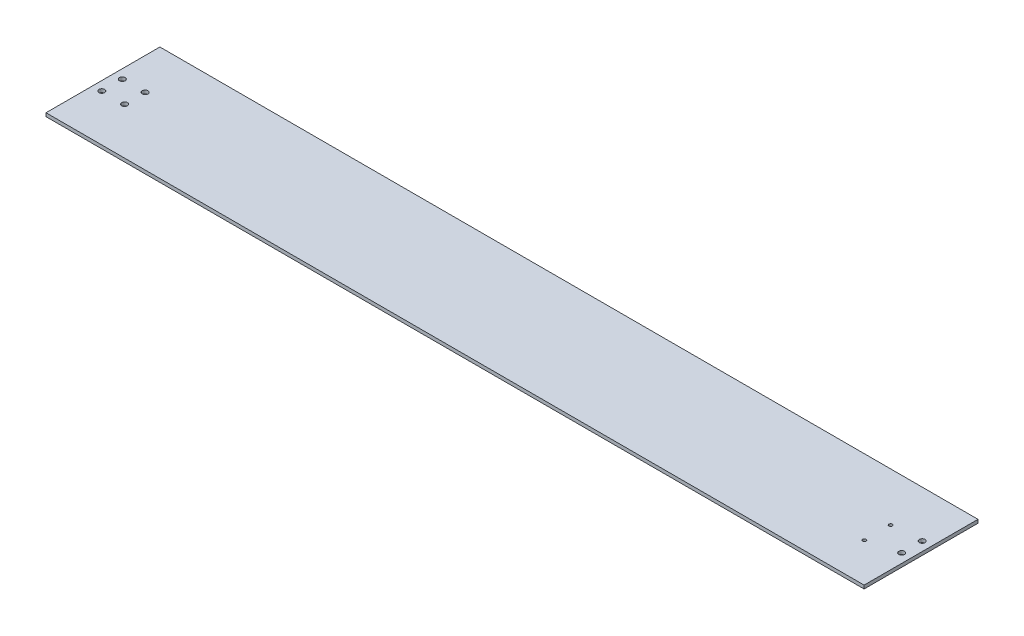
ISO-10303-21;
HEADER;
FILE_DESCRIPTION(('STEP AP214'),'2;1');
FILE_NAME('part.step','',(''),(''),'','','');
FILE_SCHEMA(('AUTOMOTIVE_DESIGN { 1 0 10303 214 1 1 1 1 }'));
ENDSEC;
DATA;
#1=APPLICATION_CONTEXT('core data for automotive mechanical design processes');
#2=APPLICATION_PROTOCOL_DEFINITION('international standard','automotive_design',2000,#1);
#3=PRODUCT_CONTEXT('',#1,'mechanical');
#4=PRODUCT('Part','Part','',(#3));
#5=PRODUCT_RELATED_PRODUCT_CATEGORY('part','',(#4));
#6=PRODUCT_DEFINITION_FORMATION('','',#4);
#7=PRODUCT_DEFINITION_CONTEXT('part definition',#1,'design');
#8=PRODUCT_DEFINITION('design','',#6,#7);
#9=PRODUCT_DEFINITION_SHAPE('','',#8);
#10=(LENGTH_UNIT() NAMED_UNIT(*) SI_UNIT(.MILLI.,.METRE.));
#11=(NAMED_UNIT(*) PLANE_ANGLE_UNIT() SI_UNIT($,.RADIAN.));
#12=(NAMED_UNIT(*) SI_UNIT($,.STERADIAN.) SOLID_ANGLE_UNIT());
#13=UNCERTAINTY_MEASURE_WITH_UNIT(LENGTH_MEASURE(1.E-05),#10,'distance_accuracy_value','');
#14=(GEOMETRIC_REPRESENTATION_CONTEXT(3) GLOBAL_UNCERTAINTY_ASSIGNED_CONTEXT((#13)) GLOBAL_UNIT_ASSIGNED_CONTEXT((#10,
#11,#12)) REPRESENTATION_CONTEXT('',''));
#15=CARTESIAN_POINT('',(0.,0.,0.));
#16=DIRECTION('',(0.,0.,1.));
#17=DIRECTION('',(1.,0.,0.));
#18=AXIS2_PLACEMENT_3D('',#15,#16,#17);
#19=CARTESIAN_POINT('',(0.,3.,0.));
#20=DIRECTION('',(-1.,0.,0.));
#21=DIRECTION('',(0.,0.,1.));
#22=AXIS2_PLACEMENT_3D('',#19,#20,#21);
#23=PLANE('',#22);
#24=DIRECTION('',(0.,0.,-1.));
#25=VECTOR('',#24,1.);
#26=CARTESIAN_POINT('',(0.,0.,0.));
#27=LINE('',#26,#25);
#28=CARTESIAN_POINT('',(0.,0.,0.));
#29=VERTEX_POINT('',#28);
#30=CARTESIAN_POINT('',(0.,0.,-100.));
#31=VERTEX_POINT('',#30);
#32=EDGE_CURVE('E102',#29,#31,#27,.T.);
#33=ORIENTED_EDGE('',*,*,#32,.T.);
#34=DIRECTION('',(0.,-1.,0.));
#35=VECTOR('',#34,1.);
#36=CARTESIAN_POINT('',(0.,3.,-100.));
#37=LINE('',#36,#35);
#38=CARTESIAN_POINT('',(0.,3.,-100.));
#39=VERTEX_POINT('',#38);
#40=EDGE_CURVE('E11',#39,#31,#37,.T.);
#41=ORIENTED_EDGE('',*,*,#40,.F.);
#42=DIRECTION('',(0.,0.,-1.));
#43=VECTOR('',#42,1.);
#44=CARTESIAN_POINT('',(0.,3.,0.));
#45=LINE('',#44,#43);
#46=CARTESIAN_POINT('',(0.,3.,0.));
#47=VERTEX_POINT('',#46);
#48=EDGE_CURVE('E89',#47,#39,#45,.T.);
#49=ORIENTED_EDGE('',*,*,#48,.F.);
#50=DIRECTION('',(0.,-1.,0.));
#51=VECTOR('',#50,1.);
#52=CARTESIAN_POINT('',(0.,3.,0.));
#53=LINE('',#52,#51);
#54=EDGE_CURVE('E98',#47,#29,#53,.T.);
#55=ORIENTED_EDGE('',*,*,#54,.T.);
#56=EDGE_LOOP('',(#33,#41,#49,#55));
#57=FACE_BOUND('',#56,.T.);
#58=ADVANCED_FACE('F36',(#57),#23,.F.);
#59=CARTESIAN_POINT('',(0.,3.,-100.));
#60=DIRECTION('',(0.,0.,1.));
#61=DIRECTION('',(1.,0.,0.));
#62=AXIS2_PLACEMENT_3D('',#59,#60,#61);
#63=PLANE('',#62);
#64=DIRECTION('',(-1.,0.,0.));
#65=VECTOR('',#64,1.);
#66=CARTESIAN_POINT('',(0.,0.,-100.));
#67=LINE('',#66,#65);
#68=CARTESIAN_POINT('',(-718.32,0.,-99.9999999999999));
#69=VERTEX_POINT('',#68);
#70=EDGE_CURVE('E93',#31,#69,#67,.T.);
#71=ORIENTED_EDGE('',*,*,#70,.T.);
#72=DIRECTION('',(0.,-1.,0.));
#73=VECTOR('',#72,1.);
#74=CARTESIAN_POINT('',(-718.32,3.,-99.9999999999999));
#75=LINE('',#74,#73);
#76=CARTESIAN_POINT('',(-718.32,3.,-99.9999999999999));
#77=VERTEX_POINT('',#76);
#78=EDGE_CURVE('E45',#77,#69,#75,.T.);
#79=ORIENTED_EDGE('',*,*,#78,.F.);
#80=DIRECTION('',(-1.,0.,0.));
#81=VECTOR('',#80,1.);
#82=CARTESIAN_POINT('',(0.,3.,-100.));
#83=LINE('',#82,#81);
#84=EDGE_CURVE('E84',#39,#77,#83,.T.);
#85=ORIENTED_EDGE('',*,*,#84,.F.);
#86=ORIENTED_EDGE('',*,*,#40,.T.);
#87=EDGE_LOOP('',(#71,#79,#85,#86));
#88=FACE_BOUND('',#87,.T.);
#89=ADVANCED_FACE('F92',(#88),#63,.F.);
#90=CARTESIAN_POINT('',(-718.32,3.,0.));
#91=DIRECTION('',(1.,0.,0.));
#92=DIRECTION('',(0.,0.,-1.));
#93=AXIS2_PLACEMENT_3D('',#90,#91,#92);
#94=PLANE('',#93);
#95=DIRECTION('',(0.,0.,1.));
#96=VECTOR('',#95,1.);
#97=CARTESIAN_POINT('',(-718.32,0.,0.));
#98=LINE('',#97,#96);
#99=CARTESIAN_POINT('',(-718.32,0.,0.));
#100=VERTEX_POINT('',#99);
#101=EDGE_CURVE('E71',#69,#100,#98,.T.);
#102=ORIENTED_EDGE('',*,*,#101,.T.);
#103=DIRECTION('',(0.,-1.,0.));
#104=VECTOR('',#103,1.);
#105=CARTESIAN_POINT('',(-718.32,3.,0.));
#106=LINE('',#105,#104);
#107=CARTESIAN_POINT('',(-718.32,3.,0.));
#108=VERTEX_POINT('',#107);
#109=EDGE_CURVE('E94',#108,#100,#106,.T.);
#110=ORIENTED_EDGE('',*,*,#109,.F.);
#111=DIRECTION('',(0.,0.,1.));
#112=VECTOR('',#111,1.);
#113=CARTESIAN_POINT('',(-718.32,3.,0.));
#114=LINE('',#113,#112);
#115=EDGE_CURVE('E87',#77,#108,#114,.T.);
#116=ORIENTED_EDGE('',*,*,#115,.F.);
#117=ORIENTED_EDGE('',*,*,#78,.T.);
#118=EDGE_LOOP('',(#102,#110,#116,#117));
#119=FACE_BOUND('',#118,.T.);
#120=ADVANCED_FACE('F96',(#119),#94,.F.);
#121=CARTESIAN_POINT('',(0.,3.,0.));
#122=DIRECTION('',(0.,0.,-1.));
#123=DIRECTION('',(-1.,0.,0.));
#124=AXIS2_PLACEMENT_3D('',#121,#122,#123);
#125=PLANE('',#124);
#126=DIRECTION('',(1.,0.,0.));
#127=VECTOR('',#126,1.);
#128=CARTESIAN_POINT('',(0.,0.,0.));
#129=LINE('',#128,#127);
#130=EDGE_CURVE('E77',#100,#29,#129,.T.);
#131=ORIENTED_EDGE('',*,*,#130,.T.);
#132=ORIENTED_EDGE('',*,*,#54,.F.);
#133=DIRECTION('',(1.,0.,0.));
#134=VECTOR('',#133,1.);
#135=CARTESIAN_POINT('',(0.,3.,0.));
#136=LINE('',#135,#134);
#137=EDGE_CURVE('E54',#108,#47,#136,.T.);
#138=ORIENTED_EDGE('',*,*,#137,.F.);
#139=ORIENTED_EDGE('',*,*,#109,.T.);
#140=EDGE_LOOP('',(#131,#132,#138,#139));
#141=FACE_BOUND('',#140,.T.);
#142=ADVANCED_FACE('F165',(#141),#125,.F.);
#143=CARTESIAN_POINT('',(0.,3.,0.));
#144=DIRECTION('',(0.,1.,0.));
#145=DIRECTION('',(0.,0.,1.));
#146=AXIS2_PLACEMENT_3D('',#143,#144,#145);
#147=PLANE('',#146);
#148=CARTESIAN_POINT('',(-34.,3.,-57.2768091799999));
#149=DIRECTION('',(0.,1.,0.));
#150=DIRECTION('',(0.,0.,1.));
#151=AXIS2_PLACEMENT_3D('',#148,#149,#150);
#152=CIRCLE('',#151,1.5);
#153=CARTESIAN_POINT('',(-34.,3.,-55.7768091799999));
#154=VERTEX_POINT('',#153);
#155=EDGE_CURVE('E132',#154,#154,#152,.T.);
#156=ORIENTED_EDGE('',*,*,#155,.F.);
#157=EDGE_LOOP('',(#156));
#158=FACE_BOUND('',#157,.T.);
#159=CARTESIAN_POINT('',(-34.,3.,-34.2768091799999));
#160=DIRECTION('',(0.,1.,0.));
#161=DIRECTION('',(0.,0.,1.));
#162=AXIS2_PLACEMENT_3D('',#159,#160,#161);
#163=CIRCLE('',#162,1.5);
#164=CARTESIAN_POINT('',(-34.,3.,-32.7768091799999));
#165=VERTEX_POINT('',#164);
#166=EDGE_CURVE('E138',#165,#165,#163,.T.);
#167=ORIENTED_EDGE('',*,*,#166,.F.);
#168=EDGE_LOOP('',(#167));
#169=FACE_BOUND('',#168,.T.);
#170=CARTESIAN_POINT('',(-690.32,3.,-58.9999999999999));
#171=DIRECTION('',(0.,1.,0.));
#172=DIRECTION('',(0.,0.,1.));
#173=AXIS2_PLACEMENT_3D('',#170,#171,#172);
#174=CIRCLE('',#173,2.49999999999991);
#175=CARTESIAN_POINT('',(-690.32,3.,-56.5));
#176=VERTEX_POINT('',#175);
#177=EDGE_CURVE('E127',#176,#176,#174,.T.);
#178=ORIENTED_EDGE('',*,*,#177,.F.);
#179=EDGE_LOOP('',(#178));
#180=FACE_BOUND('',#179,.T.);
#181=CARTESIAN_POINT('',(-690.32,3.,-40.9999999999999));
#182=DIRECTION('',(0.,1.,0.));
#183=DIRECTION('',(0.,0.,1.));
#184=AXIS2_PLACEMENT_3D('',#181,#182,#183);
#185=CIRCLE('',#184,2.49999999999991);
#186=CARTESIAN_POINT('',(-690.32,3.,-38.5));
#187=VERTEX_POINT('',#186);
#188=EDGE_CURVE('E136',#187,#187,#185,.T.);
#189=ORIENTED_EDGE('',*,*,#188,.F.);
#190=EDGE_LOOP('',(#189));
#191=FACE_BOUND('',#190,.T.);
#192=CARTESIAN_POINT('',(-8.00000000000001,3.,-59.0000000000001));
#193=DIRECTION('',(0.,1.,0.));
#194=DIRECTION('',(0.,0.,1.));
#195=AXIS2_PLACEMENT_3D('',#192,#193,#194);
#196=CIRCLE('',#195,2.5);
#197=CARTESIAN_POINT('',(-8.00000000000001,3.,-56.5000000000001));
#198=VERTEX_POINT('',#197);
#199=EDGE_CURVE('E152',#198,#198,#196,.T.);
#200=ORIENTED_EDGE('',*,*,#199,.F.);
#201=EDGE_LOOP('',(#200));
#202=FACE_BOUND('',#201,.T.);
#203=CARTESIAN_POINT('',(-710.32,3.,-41.));
#204=DIRECTION('',(0.,1.,0.));
#205=DIRECTION('',(0.,0.,1.));
#206=AXIS2_PLACEMENT_3D('',#203,#204,#205);
#207=CIRCLE('',#206,2.49999999999991);
#208=CARTESIAN_POINT('',(-710.32,3.,-38.5000000000001));
#209=VERTEX_POINT('',#208);
#210=EDGE_CURVE('E151',#209,#209,#207,.T.);
#211=ORIENTED_EDGE('',*,*,#210,.F.);
#212=EDGE_LOOP('',(#211));
#213=FACE_BOUND('',#212,.T.);
#214=CARTESIAN_POINT('',(-8.00000000000001,3.,-41.0000000000001));
#215=DIRECTION('',(0.,1.,0.));
#216=DIRECTION('',(0.,0.,1.));
#217=AXIS2_PLACEMENT_3D('',#214,#215,#216);
#218=CIRCLE('',#217,2.5);
#219=CARTESIAN_POINT('',(-8.00000000000001,3.,-38.5000000000001));
#220=VERTEX_POINT('',#219);
#221=EDGE_CURVE('E129',#220,#220,#218,.T.);
#222=ORIENTED_EDGE('',*,*,#221,.F.);
#223=EDGE_LOOP('',(#222));
#224=FACE_BOUND('',#223,.T.);
#225=CARTESIAN_POINT('',(-710.32,3.,-59.));
#226=DIRECTION('',(0.,1.,0.));
#227=DIRECTION('',(0.,0.,1.));
#228=AXIS2_PLACEMENT_3D('',#225,#226,#227);
#229=CIRCLE('',#228,2.49999999999991);
#230=CARTESIAN_POINT('',(-710.32,3.,-56.5000000000001));
#231=VERTEX_POINT('',#230);
#232=EDGE_CURVE('E115',#231,#231,#229,.T.);
#233=ORIENTED_EDGE('',*,*,#232,.F.);
#234=EDGE_LOOP('',(#233));
#235=FACE_BOUND('',#234,.T.);
#236=ORIENTED_EDGE('',*,*,#48,.T.);
#237=ORIENTED_EDGE('',*,*,#84,.T.);
#238=ORIENTED_EDGE('',*,*,#115,.T.);
#239=ORIENTED_EDGE('',*,*,#137,.T.);
#240=EDGE_LOOP('',(#236,#237,#238,#239));
#241=FACE_BOUND('',#240,.T.);
#242=ADVANCED_FACE('F85',(#158,#169,#180,#191,#202,#213,#224,#235,#241),#147,.T.);
#243=CARTESIAN_POINT('',(0.,0.,0.));
#244=DIRECTION('',(0.,1.,0.));
#245=DIRECTION('',(0.,0.,1.));
#246=AXIS2_PLACEMENT_3D('',#243,#244,#245);
#247=PLANE('',#246);
#248=CARTESIAN_POINT('',(-34.,0.,-57.2768091799999));
#249=DIRECTION('',(0.,1.,0.));
#250=DIRECTION('',(0.,0.,1.));
#251=AXIS2_PLACEMENT_3D('',#248,#249,#250);
#252=CIRCLE('',#251,1.5);
#253=CARTESIAN_POINT('',(-34.,0.,-55.7768091799999));
#254=VERTEX_POINT('',#253);
#255=EDGE_CURVE('E39',#254,#254,#252,.T.);
#256=ORIENTED_EDGE('',*,*,#255,.T.);
#257=EDGE_LOOP('',(#256));
#258=FACE_BOUND('',#257,.T.);
#259=CARTESIAN_POINT('',(-34.,0.,-34.2768091799999));
#260=DIRECTION('',(0.,1.,0.));
#261=DIRECTION('',(0.,0.,1.));
#262=AXIS2_PLACEMENT_3D('',#259,#260,#261);
#263=CIRCLE('',#262,1.5);
#264=CARTESIAN_POINT('',(-34.,0.,-32.7768091799999));
#265=VERTEX_POINT('',#264);
#266=EDGE_CURVE('E130',#265,#265,#263,.T.);
#267=ORIENTED_EDGE('',*,*,#266,.T.);
#268=EDGE_LOOP('',(#267));
#269=FACE_BOUND('',#268,.T.);
#270=CARTESIAN_POINT('',(-690.32,0.,-58.9999999999999));
#271=DIRECTION('',(0.,1.,0.));
#272=DIRECTION('',(0.,0.,1.));
#273=AXIS2_PLACEMENT_3D('',#270,#271,#272);
#274=CIRCLE('',#273,2.49999999999991);
#275=CARTESIAN_POINT('',(-690.32,0.,-56.5));
#276=VERTEX_POINT('',#275);
#277=EDGE_CURVE('E126',#276,#276,#274,.T.);
#278=ORIENTED_EDGE('',*,*,#277,.T.);
#279=EDGE_LOOP('',(#278));
#280=FACE_BOUND('',#279,.T.);
#281=CARTESIAN_POINT('',(-690.32,0.,-40.9999999999999));
#282=DIRECTION('',(0.,1.,0.));
#283=DIRECTION('',(0.,0.,1.));
#284=AXIS2_PLACEMENT_3D('',#281,#282,#283);
#285=CIRCLE('',#284,2.49999999999991);
#286=CARTESIAN_POINT('',(-690.32,0.,-38.5));
#287=VERTEX_POINT('',#286);
#288=EDGE_CURVE('E123',#287,#287,#285,.T.);
#289=ORIENTED_EDGE('',*,*,#288,.T.);
#290=EDGE_LOOP('',(#289));
#291=FACE_BOUND('',#290,.T.);
#292=CARTESIAN_POINT('',(-8.00000000000001,0.,-59.0000000000001));
#293=DIRECTION('',(0.,1.,0.));
#294=DIRECTION('',(0.,0.,1.));
#295=AXIS2_PLACEMENT_3D('',#292,#293,#294);
#296=CIRCLE('',#295,2.5);
#297=CARTESIAN_POINT('',(-8.00000000000001,0.,-56.5000000000001));
#298=VERTEX_POINT('',#297);
#299=EDGE_CURVE('E105',#298,#298,#296,.T.);
#300=ORIENTED_EDGE('',*,*,#299,.T.);
#301=EDGE_LOOP('',(#300));
#302=FACE_BOUND('',#301,.T.);
#303=CARTESIAN_POINT('',(-710.32,0.,-41.));
#304=DIRECTION('',(0.,1.,0.));
#305=DIRECTION('',(0.,0.,1.));
#306=AXIS2_PLACEMENT_3D('',#303,#304,#305);
#307=CIRCLE('',#306,2.49999999999991);
#308=CARTESIAN_POINT('',(-710.32,0.,-38.5000000000001));
#309=VERTEX_POINT('',#308);
#310=EDGE_CURVE('E118',#309,#309,#307,.T.);
#311=ORIENTED_EDGE('',*,*,#310,.T.);
#312=EDGE_LOOP('',(#311));
#313=FACE_BOUND('',#312,.T.);
#314=CARTESIAN_POINT('',(-8.00000000000001,0.,-41.0000000000001));
#315=DIRECTION('',(0.,1.,0.));
#316=DIRECTION('',(0.,0.,1.));
#317=AXIS2_PLACEMENT_3D('',#314,#315,#316);
#318=CIRCLE('',#317,2.5);
#319=CARTESIAN_POINT('',(-8.00000000000001,0.,-38.5000000000001));
#320=VERTEX_POINT('',#319);
#321=EDGE_CURVE('E114',#320,#320,#318,.T.);
#322=ORIENTED_EDGE('',*,*,#321,.T.);
#323=EDGE_LOOP('',(#322));
#324=FACE_BOUND('',#323,.T.);
#325=CARTESIAN_POINT('',(-710.32,0.,-59.));
#326=DIRECTION('',(0.,1.,0.));
#327=DIRECTION('',(0.,0.,1.));
#328=AXIS2_PLACEMENT_3D('',#325,#326,#327);
#329=CIRCLE('',#328,2.49999999999991);
#330=CARTESIAN_POINT('',(-710.32,0.,-56.5000000000001));
#331=VERTEX_POINT('',#330);
#332=EDGE_CURVE('E111',#331,#331,#329,.T.);
#333=ORIENTED_EDGE('',*,*,#332,.T.);
#334=EDGE_LOOP('',(#333));
#335=FACE_BOUND('',#334,.T.);
#336=ORIENTED_EDGE('',*,*,#32,.F.);
#337=ORIENTED_EDGE('',*,*,#130,.F.);
#338=ORIENTED_EDGE('',*,*,#101,.F.);
#339=ORIENTED_EDGE('',*,*,#70,.F.);
#340=EDGE_LOOP('',(#336,#337,#338,#339));
#341=FACE_BOUND('',#340,.T.);
#342=ADVANCED_FACE('F164',(#258,#269,#280,#291,#302,#313,#324,#335,#341),#247,.F.);
#343=CARTESIAN_POINT('',(-710.32,-27.,-59.));
#344=DIRECTION('',(0.,1.,0.));
#345=DIRECTION('',(0.,0.,1.));
#346=AXIS2_PLACEMENT_3D('',#343,#344,#345);
#347=CYLINDRICAL_SURFACE('',#346,2.49999999999991);
#348=ORIENTED_EDGE('',*,*,#232,.T.);
#349=EDGE_LOOP('',(#348));
#350=FACE_BOUND('',#349,.T.);
#351=ORIENTED_EDGE('',*,*,#332,.F.);
#352=EDGE_LOOP('',(#351));
#353=FACE_BOUND('',#352,.T.);
#354=ADVANCED_FACE('F160',(#350,#353),#347,.F.);
#355=CARTESIAN_POINT('',(-8.00000000000001,-27.,-41.0000000000001));
#356=DIRECTION('',(0.,1.,0.));
#357=DIRECTION('',(0.,0.,1.));
#358=AXIS2_PLACEMENT_3D('',#355,#356,#357);
#359=CYLINDRICAL_SURFACE('',#358,2.5);
#360=ORIENTED_EDGE('',*,*,#221,.T.);
#361=EDGE_LOOP('',(#360));
#362=FACE_BOUND('',#361,.T.);
#363=ORIENTED_EDGE('',*,*,#321,.F.);
#364=EDGE_LOOP('',(#363));
#365=FACE_BOUND('',#364,.T.);
#366=ADVANCED_FACE('F205',(#362,#365),#359,.F.);
#367=CARTESIAN_POINT('',(-710.32,-27.,-41.));
#368=DIRECTION('',(0.,1.,0.));
#369=DIRECTION('',(0.,0.,1.));
#370=AXIS2_PLACEMENT_3D('',#367,#368,#369);
#371=CYLINDRICAL_SURFACE('',#370,2.49999999999991);
#372=ORIENTED_EDGE('',*,*,#210,.T.);
#373=EDGE_LOOP('',(#372));
#374=FACE_BOUND('',#373,.T.);
#375=ORIENTED_EDGE('',*,*,#310,.F.);
#376=EDGE_LOOP('',(#375));
#377=FACE_BOUND('',#376,.T.);
#378=ADVANCED_FACE('F215',(#374,#377),#371,.F.);
#379=CARTESIAN_POINT('',(-8.00000000000001,-27.,-59.0000000000001));
#380=DIRECTION('',(0.,1.,0.));
#381=DIRECTION('',(0.,0.,1.));
#382=AXIS2_PLACEMENT_3D('',#379,#380,#381);
#383=CYLINDRICAL_SURFACE('',#382,2.5);
#384=ORIENTED_EDGE('',*,*,#199,.T.);
#385=EDGE_LOOP('',(#384));
#386=FACE_BOUND('',#385,.T.);
#387=ORIENTED_EDGE('',*,*,#299,.F.);
#388=EDGE_LOOP('',(#387));
#389=FACE_BOUND('',#388,.T.);
#390=ADVANCED_FACE('F226',(#386,#389),#383,.F.);
#391=CARTESIAN_POINT('',(-690.32,-27.,-40.9999999999999));
#392=DIRECTION('',(0.,1.,0.));
#393=DIRECTION('',(0.,0.,1.));
#394=AXIS2_PLACEMENT_3D('',#391,#392,#393);
#395=CYLINDRICAL_SURFACE('',#394,2.49999999999991);
#396=ORIENTED_EDGE('',*,*,#188,.T.);
#397=EDGE_LOOP('',(#396));
#398=FACE_BOUND('',#397,.T.);
#399=ORIENTED_EDGE('',*,*,#288,.F.);
#400=EDGE_LOOP('',(#399));
#401=FACE_BOUND('',#400,.T.);
#402=ADVANCED_FACE('F237',(#398,#401),#395,.F.);
#403=CARTESIAN_POINT('',(-690.32,-27.,-58.9999999999999));
#404=DIRECTION('',(0.,1.,0.));
#405=DIRECTION('',(0.,0.,1.));
#406=AXIS2_PLACEMENT_3D('',#403,#404,#405);
#407=CYLINDRICAL_SURFACE('',#406,2.49999999999991);
#408=ORIENTED_EDGE('',*,*,#177,.T.);
#409=EDGE_LOOP('',(#408));
#410=FACE_BOUND('',#409,.T.);
#411=ORIENTED_EDGE('',*,*,#277,.F.);
#412=EDGE_LOOP('',(#411));
#413=FACE_BOUND('',#412,.T.);
#414=ADVANCED_FACE('F248',(#410,#413),#407,.F.);
#415=CARTESIAN_POINT('',(-34.,-7.,-34.2768091799999));
#416=DIRECTION('',(0.,1.,0.));
#417=DIRECTION('',(0.,0.,1.));
#418=AXIS2_PLACEMENT_3D('',#415,#416,#417);
#419=CYLINDRICAL_SURFACE('',#418,1.5);
#420=ORIENTED_EDGE('',*,*,#166,.T.);
#421=EDGE_LOOP('',(#420));
#422=FACE_BOUND('',#421,.T.);
#423=ORIENTED_EDGE('',*,*,#266,.F.);
#424=EDGE_LOOP('',(#423));
#425=FACE_BOUND('',#424,.T.);
#426=ADVANCED_FACE('F258',(#422,#425),#419,.F.);
#427=CARTESIAN_POINT('',(-34.,-7.,-57.2768091799999));
#428=DIRECTION('',(0.,1.,0.));
#429=DIRECTION('',(0.,0.,1.));
#430=AXIS2_PLACEMENT_3D('',#427,#428,#429);
#431=CYLINDRICAL_SURFACE('',#430,1.5);
#432=ORIENTED_EDGE('',*,*,#155,.T.);
#433=EDGE_LOOP('',(#432));
#434=FACE_BOUND('',#433,.T.);
#435=ORIENTED_EDGE('',*,*,#255,.F.);
#436=EDGE_LOOP('',(#435));
#437=FACE_BOUND('',#436,.T.);
#438=ADVANCED_FACE('F280',(#434,#437),#431,.F.);
#439=CLOSED_SHELL('',(#58,#89,#120,#142,#242,#342,#354,#366,#378,#390,#402,#414,#426,#438));
#440=MANIFOLD_SOLID_BREP('B2',#439);
#441=ADVANCED_BREP_SHAPE_REPRESENTATION('',(#18,#440),#14);
#442=SHAPE_DEFINITION_REPRESENTATION(#9,#441);
ENDSEC;
END-ISO-10303-21;
